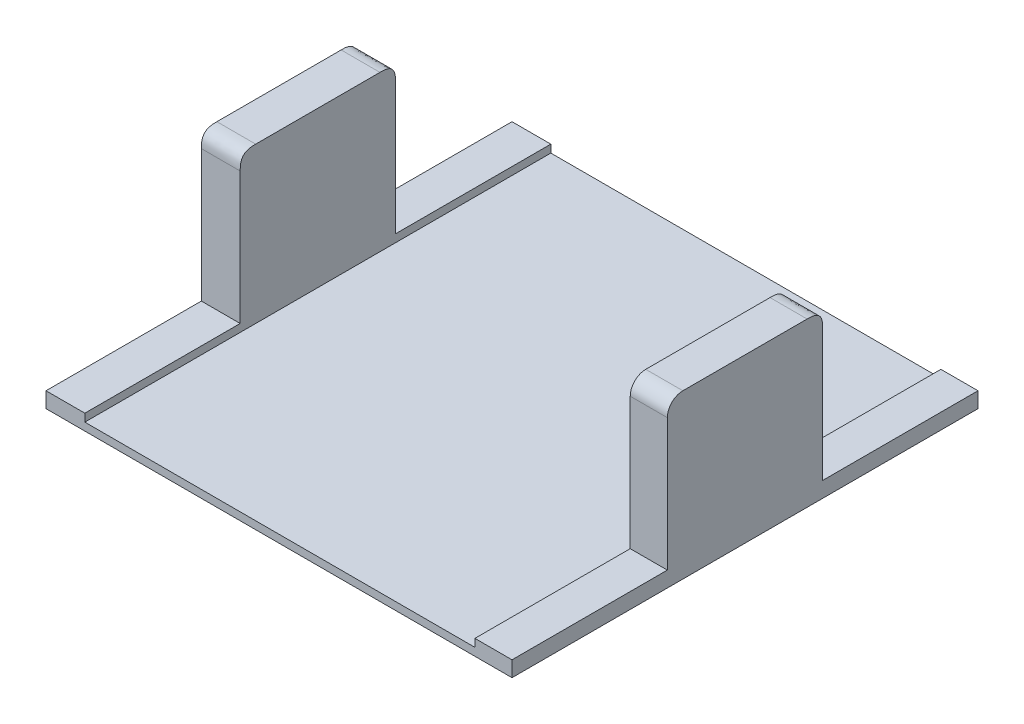
ISO-10303-21;
HEADER;
FILE_DESCRIPTION(('STEP AP214'),'2;1');
FILE_NAME('part.step','',(''),(''),'','','');
FILE_SCHEMA(('AUTOMOTIVE_DESIGN { 1 0 10303 214 1 1 1 1 }'));
ENDSEC;
DATA;
#1=APPLICATION_CONTEXT('core data for automotive mechanical design processes');
#2=APPLICATION_PROTOCOL_DEFINITION('international standard','automotive_design',2000,#1);
#3=PRODUCT_CONTEXT('',#1,'mechanical');
#4=PRODUCT('Part','Part','',(#3));
#5=PRODUCT_RELATED_PRODUCT_CATEGORY('part','',(#4));
#6=PRODUCT_DEFINITION_FORMATION('','',#4);
#7=PRODUCT_DEFINITION_CONTEXT('part definition',#1,'design');
#8=PRODUCT_DEFINITION('design','',#6,#7);
#9=PRODUCT_DEFINITION_SHAPE('','',#8);
#10=(LENGTH_UNIT() NAMED_UNIT(*) SI_UNIT(.MILLI.,.METRE.));
#11=(NAMED_UNIT(*) PLANE_ANGLE_UNIT() SI_UNIT($,.RADIAN.));
#12=(NAMED_UNIT(*) SI_UNIT($,.STERADIAN.) SOLID_ANGLE_UNIT());
#13=UNCERTAINTY_MEASURE_WITH_UNIT(LENGTH_MEASURE(1.E-05),#10,'distance_accuracy_value','');
#14=(GEOMETRIC_REPRESENTATION_CONTEXT(3) GLOBAL_UNCERTAINTY_ASSIGNED_CONTEXT((#13)) GLOBAL_UNIT_ASSIGNED_CONTEXT((#10,
#11,#12)) REPRESENTATION_CONTEXT('',''));
#15=CARTESIAN_POINT('',(0.,0.,0.));
#16=DIRECTION('',(0.,0.,1.));
#17=DIRECTION('',(1.,0.,0.));
#18=AXIS2_PLACEMENT_3D('',#15,#16,#17);
#19=CARTESIAN_POINT('',(0.,200.,0.));
#20=DIRECTION('',(0.,0.,-1.));
#21=DIRECTION('',(-1.,0.,0.));
#22=AXIS2_PLACEMENT_3D('',#19,#20,#21);
#23=PLANE('',#22);
#24=DIRECTION('',(0.,-1.,0.));
#25=VECTOR('',#24,1.);
#26=CARTESIAN_POINT('',(600.,0.,0.));
#27=LINE('',#26,#25);
#28=CARTESIAN_POINT('',(600.,10.,0.));
#29=VERTEX_POINT('',#28);
#30=CARTESIAN_POINT('',(600.,-9.99999999999998,0.));
#31=VERTEX_POINT('',#30);
#32=EDGE_CURVE('E478',#29,#31,#27,.T.);
#33=ORIENTED_EDGE('',*,*,#32,.F.);
#34=DIRECTION('',(1.,0.,0.));
#35=VECTOR('',#34,1.);
#36=CARTESIAN_POINT('',(-1.11022302462516E-13,10.,0.));
#37=LINE('',#36,#35);
#38=CARTESIAN_POINT('',(552.227783009212,10.,0.));
#39=VERTEX_POINT('',#38);
#40=EDGE_CURVE('E301',#39,#29,#37,.T.);
#41=ORIENTED_EDGE('',*,*,#40,.F.);
#42=DIRECTION('',(0.,-1.,0.));
#43=VECTOR('',#42,1.);
#44=CARTESIAN_POINT('',(552.227783009212,200.,0.));
#45=LINE('',#44,#43);
#46=CARTESIAN_POINT('',(552.227783009212,0.,0.));
#47=VERTEX_POINT('',#46);
#48=EDGE_CURVE('E492',#39,#47,#45,.T.);
#49=ORIENTED_EDGE('',*,*,#48,.T.);
#50=DIRECTION('',(1.,0.,0.));
#51=VECTOR('',#50,1.);
#52=CARTESIAN_POINT('',(600.,0.,0.));
#53=LINE('',#52,#51);
#54=CARTESIAN_POINT('',(50.,0.,0.));
#55=VERTEX_POINT('',#54);
#56=EDGE_CURVE('E479',#55,#47,#53,.T.);
#57=ORIENTED_EDGE('',*,*,#56,.F.);
#58=DIRECTION('',(0.,-1.,0.));
#59=VECTOR('',#58,1.);
#60=CARTESIAN_POINT('',(50.,200.,0.));
#61=LINE('',#60,#59);
#62=CARTESIAN_POINT('',(50.,10.,0.));
#63=VERTEX_POINT('',#62);
#64=EDGE_CURVE('E435',#63,#55,#61,.T.);
#65=ORIENTED_EDGE('',*,*,#64,.F.);
#66=CARTESIAN_POINT('',(-1.11022302462516E-13,10.,0.));
#67=VERTEX_POINT('',#66);
#68=EDGE_CURVE('E320',#67,#63,#37,.T.);
#69=ORIENTED_EDGE('',*,*,#68,.F.);
#70=DIRECTION('',(0.,-1.,0.));
#71=VECTOR('',#70,1.);
#72=CARTESIAN_POINT('',(0.,200.,0.));
#73=LINE('',#72,#71);
#74=CARTESIAN_POINT('',(-1.11022302462516E-13,-9.99999999999998,0.));
#75=VERTEX_POINT('',#74);
#76=EDGE_CURVE('E441',#67,#75,#73,.T.);
#77=ORIENTED_EDGE('',*,*,#76,.T.);
#78=DIRECTION('',(1.,0.,0.));
#79=VECTOR('',#78,1.);
#80=CARTESIAN_POINT('',(600.,-9.99999999999998,0.));
#81=LINE('',#80,#79);
#82=EDGE_CURVE('E482',#75,#31,#81,.T.);
#83=ORIENTED_EDGE('',*,*,#82,.T.);
#84=EDGE_LOOP('',(#33,#41,#49,#57,#65,#69,#77,#83));
#85=FACE_BOUND('',#84,.T.);
#86=ADVANCED_FACE('F42',(#85),#23,.F.);
#87=CARTESIAN_POINT('',(50.,200.,0.));
#88=DIRECTION('',(-1.,0.,0.));
#89=DIRECTION('',(0.,0.,1.));
#90=AXIS2_PLACEMENT_3D('',#87,#88,#89);
#91=PLANE('',#90);
#92=DIRECTION('',(0.,1.,0.));
#93=VECTOR('',#92,1.);
#94=CARTESIAN_POINT('',(50.,200.,-400.));
#95=LINE('',#94,#93);
#96=CARTESIAN_POINT('',(50.,9.9999999999999,-400.));
#97=VERTEX_POINT('',#96);
#98=CARTESIAN_POINT('',(50.,180.,-400.));
#99=VERTEX_POINT('',#98);
#100=EDGE_CURVE('E203',#97,#99,#95,.T.);
#101=ORIENTED_EDGE('',*,*,#100,.T.);
#102=CARTESIAN_POINT('',(49.999999999997,200.,-380.));
#103=CARTESIAN_POINT('',(49.999999999997,200.,-383.363961030679));
#104=CARTESIAN_POINT('',(49.999999999997,200.,-386.727922061358));
#105=CARTESIAN_POINT('',(50.0000000000049,198.566161603278,-394.142135623731));
#106=CARTESIAN_POINT('',(50.0000000000049,194.142135623731,-398.566161603278));
#107=CARTESIAN_POINT('',(49.999999999997,186.727922061358,-400.));
#108=CARTESIAN_POINT('',(49.999999999997,183.363961030679,-400.));
#109=CARTESIAN_POINT('',(49.999999999997,180.,-400.));
#110=B_SPLINE_CURVE_WITH_KNOTS('',5,(#102,#103,#104,#105,#106,#107,#108,#109),.UNSPECIFIED.,.F.,
.F.,(6,2,6),(0.,0.5,1.),.UNSPECIFIED.);
#111=CARTESIAN_POINT('',(50.,200.,-380.));
#112=VERTEX_POINT('',#111);
#113=EDGE_CURVE('E71',#99,#112,#110,.F.);
#114=ORIENTED_EDGE('',*,*,#113,.T.);
#115=DIRECTION('',(0.,0.,-1.));
#116=VECTOR('',#115,1.);
#117=CARTESIAN_POINT('',(50.,200.,0.));
#118=LINE('',#117,#116);
#119=CARTESIAN_POINT('',(50.,200.,-220.));
#120=VERTEX_POINT('',#119);
#121=EDGE_CURVE('E447',#120,#112,#118,.T.);
#122=ORIENTED_EDGE('',*,*,#121,.F.);
#123=CARTESIAN_POINT('',(49.999999999997,180.,-200.));
#124=CARTESIAN_POINT('',(49.999999999997,183.363961030679,-200.));
#125=CARTESIAN_POINT('',(49.999999999997,186.727922061358,-200.));
#126=CARTESIAN_POINT('',(50.0000000000049,194.142135623731,-201.433838396722));
#127=CARTESIAN_POINT('',(50.0000000000049,198.566161603278,-205.857864376269));
#128=CARTESIAN_POINT('',(49.999999999997,200.,-213.272077938642));
#129=CARTESIAN_POINT('',(49.999999999997,200.,-216.636038969321));
#130=CARTESIAN_POINT('',(49.999999999997,200.,-220.));
#131=B_SPLINE_CURVE_WITH_KNOTS('',5,(#123,#124,#125,#126,#127,#128,#129,#130),.UNSPECIFIED.,.F.,
.F.,(6,2,6),(0.,0.5,1.),.UNSPECIFIED.);
#132=CARTESIAN_POINT('',(50.,180.,-200.));
#133=VERTEX_POINT('',#132);
#134=EDGE_CURVE('E398',#120,#133,#131,.F.);
#135=ORIENTED_EDGE('',*,*,#134,.T.);
#136=DIRECTION('',(0.,-1.,0.));
#137=VECTOR('',#136,1.);
#138=CARTESIAN_POINT('',(50.,200.,-200.));
#139=LINE('',#138,#137);
#140=CARTESIAN_POINT('',(50.,10.,-200.));
#141=VERTEX_POINT('',#140);
#142=EDGE_CURVE('E323',#133,#141,#139,.T.);
#143=ORIENTED_EDGE('',*,*,#142,.T.);
#144=DIRECTION('',(0.,0.,1.));
#145=VECTOR('',#144,1.);
#146=CARTESIAN_POINT('',(50.,10.,0.));
#147=LINE('',#146,#145);
#148=EDGE_CURVE('E326',#141,#63,#147,.T.);
#149=ORIENTED_EDGE('',*,*,#148,.T.);
#150=ORIENTED_EDGE('',*,*,#64,.T.);
#151=DIRECTION('',(0.,0.,-1.));
#152=VECTOR('',#151,1.);
#153=CARTESIAN_POINT('',(50.,0.,0.));
#154=LINE('',#153,#152);
#155=CARTESIAN_POINT('',(50.,0.,-600.));
#156=VERTEX_POINT('',#155);
#157=EDGE_CURVE('E444',#55,#156,#154,.T.);
#158=ORIENTED_EDGE('',*,*,#157,.T.);
#159=DIRECTION('',(0.,-1.,0.));
#160=VECTOR('',#159,1.);
#161=CARTESIAN_POINT('',(50.,200.,-600.));
#162=LINE('',#161,#160);
#163=CARTESIAN_POINT('',(50.,10.,-600.));
#164=VERTEX_POINT('',#163);
#165=EDGE_CURVE('E437',#164,#156,#162,.T.);
#166=ORIENTED_EDGE('',*,*,#165,.F.);
#167=DIRECTION('',(0.,0.,1.));
#168=VECTOR('',#167,1.);
#169=CARTESIAN_POINT('',(50.,9.9999999999997,-1.00527225432856E-13));
#170=LINE('',#169,#168);
#171=EDGE_CURVE('E312',#164,#97,#170,.T.);
#172=ORIENTED_EDGE('',*,*,#171,.T.);
#173=EDGE_LOOP('',(#101,#114,#122,#135,#143,#149,#150,#158,#166,#172));
#174=FACE_BOUND('',#173,.T.);
#175=ADVANCED_FACE('F272',(#174),#91,.F.);
#176=CARTESIAN_POINT('',(0.,200.,-600.));
#177=DIRECTION('',(0.,0.,-1.));
#178=DIRECTION('',(-1.,0.,0.));
#179=AXIS2_PLACEMENT_3D('',#176,#177,#178);
#180=PLANE('',#179);
#181=DIRECTION('',(1.,0.,0.));
#182=VECTOR('',#181,1.);
#183=CARTESIAN_POINT('',(0.,10.,-600.));
#184=LINE('',#183,#182);
#185=CARTESIAN_POINT('',(552.227783009212,10.,-600.));
#186=VERTEX_POINT('',#185);
#187=CARTESIAN_POINT('',(600.,10.,-600.));
#188=VERTEX_POINT('',#187);
#189=EDGE_CURVE('E206',#186,#188,#184,.T.);
#190=ORIENTED_EDGE('',*,*,#189,.T.);
#191=DIRECTION('',(0.,-1.,0.));
#192=VECTOR('',#191,1.);
#193=CARTESIAN_POINT('',(600.,0.,-600.));
#194=LINE('',#193,#192);
#195=CARTESIAN_POINT('',(600.,-9.99999999999998,-600.));
#196=VERTEX_POINT('',#195);
#197=EDGE_CURVE('E448',#188,#196,#194,.T.);
#198=ORIENTED_EDGE('',*,*,#197,.T.);
#199=DIRECTION('',(-1.,0.,0.));
#200=VECTOR('',#199,1.);
#201=CARTESIAN_POINT('',(600.,-9.99999999999998,-600.));
#202=LINE('',#201,#200);
#203=CARTESIAN_POINT('',(-1.11022302462516E-13,-9.99999999999998,-600.));
#204=VERTEX_POINT('',#203);
#205=EDGE_CURVE('E489',#196,#204,#202,.T.);
#206=ORIENTED_EDGE('',*,*,#205,.T.);
#207=DIRECTION('',(0.,-1.,0.));
#208=VECTOR('',#207,1.);
#209=CARTESIAN_POINT('',(-1.11022302462516E-13,200.,-600.));
#210=LINE('',#209,#208);
#211=CARTESIAN_POINT('',(0.,10.,-600.));
#212=VERTEX_POINT('',#211);
#213=EDGE_CURVE('E439',#212,#204,#210,.T.);
#214=ORIENTED_EDGE('',*,*,#213,.F.);
#215=EDGE_CURVE('E211',#212,#164,#184,.T.);
#216=ORIENTED_EDGE('',*,*,#215,.T.);
#217=ORIENTED_EDGE('',*,*,#165,.T.);
#218=DIRECTION('',(-1.,0.,0.));
#219=VECTOR('',#218,1.);
#220=CARTESIAN_POINT('',(600.,0.,-600.));
#221=LINE('',#220,#219);
#222=CARTESIAN_POINT('',(552.227783009212,0.,-600.));
#223=VERTEX_POINT('',#222);
#224=EDGE_CURVE('E485',#223,#156,#221,.T.);
#225=ORIENTED_EDGE('',*,*,#224,.F.);
#226=DIRECTION('',(0.,-1.,0.));
#227=VECTOR('',#226,1.);
#228=CARTESIAN_POINT('',(552.227783009212,200.,-600.));
#229=LINE('',#228,#227);
#230=EDGE_CURVE('E471',#186,#223,#229,.T.);
#231=ORIENTED_EDGE('',*,*,#230,.F.);
#232=EDGE_LOOP('',(#190,#198,#206,#214,#216,#217,#225,#231));
#233=FACE_BOUND('',#232,.T.);
#234=ADVANCED_FACE('F282',(#233),#180,.T.);
#235=CARTESIAN_POINT('',(0.,200.,0.));
#236=DIRECTION('',(-1.,0.,0.));
#237=DIRECTION('',(0.,0.,1.));
#238=AXIS2_PLACEMENT_3D('',#235,#236,#237);
#239=PLANE('',#238);
#240=DIRECTION('',(0.,0.,-1.));
#241=VECTOR('',#240,1.);
#242=CARTESIAN_POINT('',(0.,200.,0.));
#243=LINE('',#242,#241);
#244=CARTESIAN_POINT('',(0.,200.,-220.));
#245=VERTEX_POINT('',#244);
#246=CARTESIAN_POINT('',(0.,200.,-380.));
#247=VERTEX_POINT('',#246);
#248=EDGE_CURVE('E443',#245,#247,#243,.T.);
#249=ORIENTED_EDGE('',*,*,#248,.T.);
#250=CARTESIAN_POINT('',(-2.10443641679436E-13,180.,-400.));
#251=CARTESIAN_POINT('',(-2.10443641679436E-13,183.363961030679,-400.));
#252=CARTESIAN_POINT('',(-2.10443641679436E-13,186.727922061358,-400.));
#253=CARTESIAN_POINT('',(1.66208193042028E-13,194.142135623731,-398.566161603278));
#254=CARTESIAN_POINT('',(1.66208193042028E-13,198.566161603278,-394.142135623731));
#255=CARTESIAN_POINT('',(-2.10443641679436E-13,200.,-386.727922061358));
#256=CARTESIAN_POINT('',(-2.10443641679436E-13,200.,-383.363961030679));
#257=CARTESIAN_POINT('',(-2.10443641679436E-13,200.,-380.));
#258=B_SPLINE_CURVE_WITH_KNOTS('',5,(#250,#251,#252,#253,#254,#255,#256,#257),.UNSPECIFIED.,.F.,
.F.,(6,2,6),(0.,0.5,1.),.UNSPECIFIED.);
#259=CARTESIAN_POINT('',(0.,180.,-400.));
#260=VERTEX_POINT('',#259);
#261=EDGE_CURVE('E11',#247,#260,#258,.F.);
#262=ORIENTED_EDGE('',*,*,#261,.T.);
#263=DIRECTION('',(0.,-1.,0.));
#264=VECTOR('',#263,1.);
#265=CARTESIAN_POINT('',(0.,200.,-400.));
#266=LINE('',#265,#264);
#267=CARTESIAN_POINT('',(0.,9.9999999999999,-400.));
#268=VERTEX_POINT('',#267);
#269=EDGE_CURVE('E187',#260,#268,#266,.T.);
#270=ORIENTED_EDGE('',*,*,#269,.T.);
#271=DIRECTION('',(0.,0.,-1.));
#272=VECTOR('',#271,1.);
#273=CARTESIAN_POINT('',(0.,10.,-600.));
#274=LINE('',#273,#272);
#275=EDGE_CURVE('E191',#268,#212,#274,.T.);
#276=ORIENTED_EDGE('',*,*,#275,.T.);
#277=ORIENTED_EDGE('',*,*,#213,.T.);
#278=DIRECTION('',(0.,0.,1.));
#279=VECTOR('',#278,1.);
#280=CARTESIAN_POINT('',(-1.11022302462516E-13,-9.99999999999998,0.));
#281=LINE('',#280,#279);
#282=EDGE_CURVE('E486',#204,#75,#281,.T.);
#283=ORIENTED_EDGE('',*,*,#282,.T.);
#284=ORIENTED_EDGE('',*,*,#76,.F.);
#285=DIRECTION('',(0.,0.,-1.));
#286=VECTOR('',#285,1.);
#287=CARTESIAN_POINT('',(-1.11022302462516E-13,10.,0.));
#288=LINE('',#287,#286);
#289=CARTESIAN_POINT('',(-1.11022302462516E-13,10.,-200.));
#290=VERTEX_POINT('',#289);
#291=EDGE_CURVE('E302',#67,#290,#288,.T.);
#292=ORIENTED_EDGE('',*,*,#291,.T.);
#293=DIRECTION('',(0.,1.,0.));
#294=VECTOR('',#293,1.);
#295=CARTESIAN_POINT('',(-1.11022302462516E-13,200.,-200.));
#296=LINE('',#295,#294);
#297=CARTESIAN_POINT('',(-1.11022302462516E-13,180.,-200.));
#298=VERTEX_POINT('',#297);
#299=EDGE_CURVE('E292',#290,#298,#296,.T.);
#300=ORIENTED_EDGE('',*,*,#299,.T.);
#301=CARTESIAN_POINT('',(-1.87350135405495E-13,200.,-220.));
#302=CARTESIAN_POINT('',(-1.87350135405495E-13,200.,-216.636038969321));
#303=CARTESIAN_POINT('',(-1.87350135405495E-13,200.,-213.272077938642));
#304=CARTESIAN_POINT('',(1.88976438664223E-13,198.566161603278,-205.857864376269));
#305=CARTESIAN_POINT('',(1.88976438664223E-13,194.142135623731,-201.433838396722));
#306=CARTESIAN_POINT('',(-1.87350135405495E-13,186.727922061358,-200.));
#307=CARTESIAN_POINT('',(-1.87350135405495E-13,183.363961030679,-200.));
#308=CARTESIAN_POINT('',(-1.87350135405495E-13,180.,-200.));
#309=B_SPLINE_CURVE_WITH_KNOTS('',5,(#301,#302,#303,#304,#305,#306,#307,#308),.UNSPECIFIED.,.F.,
.F.,(6,2,6),(0.,0.5,1.),.UNSPECIFIED.);
#310=EDGE_CURVE('E394',#298,#245,#309,.F.);
#311=ORIENTED_EDGE('',*,*,#310,.T.);
#312=EDGE_LOOP('',(#249,#262,#270,#276,#277,#283,#284,#292,#300,#311));
#313=FACE_BOUND('',#312,.T.);
#314=ADVANCED_FACE('F189',(#313),#239,.T.);
#315=CARTESIAN_POINT('',(0.,200.,0.));
#316=DIRECTION('',(0.,1.,0.));
#317=DIRECTION('',(0.,0.,1.));
#318=AXIS2_PLACEMENT_3D('',#315,#316,#317);
#319=PLANE('',#318);
#320=ORIENTED_EDGE('',*,*,#121,.T.);
#321=CARTESIAN_POINT('',(-2.50000000000008,200.,-380.));
#322=CARTESIAN_POINT('',(15.8333333333333,200.,-380.));
#323=CARTESIAN_POINT('',(34.1666666666666,200.,-380.));
#324=CARTESIAN_POINT('',(52.5,200.,-380.));
#325=B_SPLINE_CURVE_WITH_KNOTS('',3,(#321,#322,#323,#324),.UNSPECIFIED.,.F.,.F.,(4,4),(-0.0525,
0.00250000000000008),.UNSPECIFIED.);
#326=EDGE_CURVE('E56',#112,#247,#325,.F.);
#327=ORIENTED_EDGE('',*,*,#326,.T.);
#328=ORIENTED_EDGE('',*,*,#248,.F.);
#329=CARTESIAN_POINT('',(52.5,200.,-220.));
#330=CARTESIAN_POINT('',(34.1666666666666,200.,-220.));
#331=CARTESIAN_POINT('',(15.8333333333333,200.,-220.));
#332=CARTESIAN_POINT('',(-2.5000000000001,200.,-220.));
#333=B_SPLINE_CURVE_WITH_KNOTS('',3,(#329,#330,#331,#332),.UNSPECIFIED.,.F.,.F.,(4,4),(-0.0525,
0.00250000000000012),.UNSPECIFIED.);
#334=EDGE_CURVE('E403',#245,#120,#333,.F.);
#335=ORIENTED_EDGE('',*,*,#334,.T.);
#336=EDGE_LOOP('',(#320,#327,#328,#335));
#337=FACE_BOUND('',#336,.T.);
#338=ADVANCED_FACE('F335',(#337),#319,.T.);
#339=CARTESIAN_POINT('',(0.,0.,0.));
#340=DIRECTION('',(0.,1.,0.));
#341=DIRECTION('',(0.,0.,1.));
#342=AXIS2_PLACEMENT_3D('',#339,#340,#341);
#343=PLANE('',#342);
#344=DIRECTION('',(0.,0.,-1.));
#345=VECTOR('',#344,1.);
#346=CARTESIAN_POINT('',(552.227783009212,0.,0.));
#347=LINE('',#346,#345);
#348=EDGE_CURVE('E499',#47,#223,#347,.T.);
#349=ORIENTED_EDGE('',*,*,#348,.T.);
#350=ORIENTED_EDGE('',*,*,#224,.T.);
#351=ORIENTED_EDGE('',*,*,#157,.F.);
#352=ORIENTED_EDGE('',*,*,#56,.T.);
#353=EDGE_LOOP('',(#349,#350,#351,#352));
#354=FACE_BOUND('',#353,.T.);
#355=ADVANCED_FACE('F344',(#354),#343,.T.);
#356=CARTESIAN_POINT('',(600.,0.,0.));
#357=DIRECTION('',(-1.,0.,0.));
#358=DIRECTION('',(0.,0.,1.));
#359=AXIS2_PLACEMENT_3D('',#356,#357,#358);
#360=PLANE('',#359);
#361=DIRECTION('',(0.,-1.,0.));
#362=VECTOR('',#361,1.);
#363=CARTESIAN_POINT('',(600.,200.,-400.));
#364=LINE('',#363,#362);
#365=CARTESIAN_POINT('',(600.,180.,-400.));
#366=VERTEX_POINT('',#365);
#367=CARTESIAN_POINT('',(600.,9.9999999999999,-400.));
#368=VERTEX_POINT('',#367);
#369=EDGE_CURVE('E221',#366,#368,#364,.T.);
#370=ORIENTED_EDGE('',*,*,#369,.F.);
#371=CARTESIAN_POINT('',(600.,200.,-380.));
#372=CARTESIAN_POINT('',(600.,200.,-383.363961030679));
#373=CARTESIAN_POINT('',(600.,200.,-386.727922061358));
#374=CARTESIAN_POINT('',(600.,198.566161603278,-394.142135623731));
#375=CARTESIAN_POINT('',(600.,194.142135623731,-398.566161603278));
#376=CARTESIAN_POINT('',(600.,186.727922061358,-400.));
#377=CARTESIAN_POINT('',(600.,183.363961030679,-400.));
#378=CARTESIAN_POINT('',(600.,180.,-400.));
#379=B_SPLINE_CURVE_WITH_KNOTS('',5,(#371,#372,#373,#374,#375,#376,#377,#378),.UNSPECIFIED.,.F.,
.F.,(6,2,6),(0.,0.5,1.),.UNSPECIFIED.);
#380=CARTESIAN_POINT('',(600.,200.,-380.));
#381=VERTEX_POINT('',#380);
#382=EDGE_CURVE('E412',#366,#381,#379,.F.);
#383=ORIENTED_EDGE('',*,*,#382,.T.);
#384=DIRECTION('',(0.,0.,-1.));
#385=VECTOR('',#384,1.);
#386=CARTESIAN_POINT('',(600.,200.,-1.11022302462516E-13));
#387=LINE('',#386,#385);
#388=CARTESIAN_POINT('',(600.,200.,-220.));
#389=VERTEX_POINT('',#388);
#390=EDGE_CURVE('E238',#389,#381,#387,.T.);
#391=ORIENTED_EDGE('',*,*,#390,.F.);
#392=CARTESIAN_POINT('',(600.,180.,-220.));
#393=DIRECTION('',(-1.,0.,0.));
#394=DIRECTION('',(0.,0.,1.));
#395=AXIS2_PLACEMENT_3D('',#392,#393,#394);
#396=CIRCLE('',#395,20.);
#397=CARTESIAN_POINT('',(600.,180.,-200.));
#398=VERTEX_POINT('',#397);
#399=EDGE_CURVE('E420',#389,#398,#396,.F.);
#400=ORIENTED_EDGE('',*,*,#399,.T.);
#401=DIRECTION('',(0.,1.,0.));
#402=VECTOR('',#401,1.);
#403=CARTESIAN_POINT('',(600.,200.,-200.));
#404=LINE('',#403,#402);
#405=CARTESIAN_POINT('',(600.,10.,-200.));
#406=VERTEX_POINT('',#405);
#407=EDGE_CURVE('E311',#406,#398,#404,.T.);
#408=ORIENTED_EDGE('',*,*,#407,.F.);
#409=DIRECTION('',(0.,0.,-1.));
#410=VECTOR('',#409,1.);
#411=CARTESIAN_POINT('',(600.,10.,0.));
#412=LINE('',#411,#410);
#413=EDGE_CURVE('E308',#29,#406,#412,.T.);
#414=ORIENTED_EDGE('',*,*,#413,.F.);
#415=ORIENTED_EDGE('',*,*,#32,.T.);
#416=DIRECTION('',(0.,0.,-1.));
#417=VECTOR('',#416,1.);
#418=CARTESIAN_POINT('',(600.,-9.99999999999998,0.));
#419=LINE('',#418,#417);
#420=EDGE_CURVE('E477',#31,#196,#419,.T.);
#421=ORIENTED_EDGE('',*,*,#420,.T.);
#422=ORIENTED_EDGE('',*,*,#197,.F.);
#423=DIRECTION('',(0.,0.,-1.));
#424=VECTOR('',#423,1.);
#425=CARTESIAN_POINT('',(600.,10.,-600.));
#426=LINE('',#425,#424);
#427=EDGE_CURVE('E198',#368,#188,#426,.T.);
#428=ORIENTED_EDGE('',*,*,#427,.F.);
#429=EDGE_LOOP('',(#370,#383,#391,#400,#408,#414,#415,#421,#422,#428));
#430=FACE_BOUND('',#429,.T.);
#431=ADVANCED_FACE('F345',(#430),#360,.F.);
#432=CARTESIAN_POINT('',(0.,-9.99999999999998,0.));
#433=DIRECTION('',(0.,1.,0.));
#434=DIRECTION('',(0.,0.,1.));
#435=AXIS2_PLACEMENT_3D('',#432,#433,#434);
#436=PLANE('',#435);
#437=ORIENTED_EDGE('',*,*,#420,.F.);
#438=ORIENTED_EDGE('',*,*,#82,.F.);
#439=ORIENTED_EDGE('',*,*,#282,.F.);
#440=ORIENTED_EDGE('',*,*,#205,.F.);
#441=EDGE_LOOP('',(#437,#438,#439,#440));
#442=FACE_BOUND('',#441,.T.);
#443=ADVANCED_FACE('F527',(#442),#436,.F.);
#444=CARTESIAN_POINT('',(552.227783009212,200.,0.));
#445=DIRECTION('',(-1.,0.,0.));
#446=DIRECTION('',(0.,0.,1.));
#447=AXIS2_PLACEMENT_3D('',#444,#445,#446);
#448=PLANE('',#447);
#449=DIRECTION('',(0.,0.,-1.));
#450=VECTOR('',#449,1.);
#451=CARTESIAN_POINT('',(552.227783009212,200.,0.));
#452=LINE('',#451,#450);
#453=CARTESIAN_POINT('',(552.227783009212,200.,-220.));
#454=VERTEX_POINT('',#453);
#455=CARTESIAN_POINT('',(552.227783009212,200.,-380.));
#456=VERTEX_POINT('',#455);
#457=EDGE_CURVE('E501',#454,#456,#452,.T.);
#458=ORIENTED_EDGE('',*,*,#457,.T.);
#459=CARTESIAN_POINT('',(552.227783009212,180.,-400.));
#460=CARTESIAN_POINT('',(552.227783009212,183.363961030679,-400.));
#461=CARTESIAN_POINT('',(552.227783009212,186.727922061358,-400.));
#462=CARTESIAN_POINT('',(552.227783009212,194.142135623731,-398.566161603278));
#463=CARTESIAN_POINT('',(552.227783009212,198.566161603278,-394.142135623731));
#464=CARTESIAN_POINT('',(552.227783009212,200.,-386.727922061358));
#465=CARTESIAN_POINT('',(552.227783009212,200.,-383.363961030679));
#466=CARTESIAN_POINT('',(552.227783009212,200.,-380.));
#467=B_SPLINE_CURVE_WITH_KNOTS('',5,(#459,#460,#461,#462,#463,#464,#465,#466),.UNSPECIFIED.,.F.,
.F.,(6,2,6),(0.,0.5,1.),.UNSPECIFIED.);
#468=CARTESIAN_POINT('',(552.227783009212,180.,-400.));
#469=VERTEX_POINT('',#468);
#470=EDGE_CURVE('E404',#456,#469,#467,.F.);
#471=ORIENTED_EDGE('',*,*,#470,.T.);
#472=DIRECTION('',(0.,1.,0.));
#473=VECTOR('',#472,1.);
#474=CARTESIAN_POINT('',(552.227783009212,200.,-400.));
#475=LINE('',#474,#473);
#476=CARTESIAN_POINT('',(552.227783009212,9.9999999999999,-400.));
#477=VERTEX_POINT('',#476);
#478=EDGE_CURVE('E224',#477,#469,#475,.T.);
#479=ORIENTED_EDGE('',*,*,#478,.F.);
#480=DIRECTION('',(0.,0.,1.));
#481=VECTOR('',#480,1.);
#482=CARTESIAN_POINT('',(552.227783009212,9.9999999999997,-1.00527225432856E-13));
#483=LINE('',#482,#481);
#484=EDGE_CURVE('E431',#186,#477,#483,.T.);
#485=ORIENTED_EDGE('',*,*,#484,.F.);
#486=ORIENTED_EDGE('',*,*,#230,.T.);
#487=ORIENTED_EDGE('',*,*,#348,.F.);
#488=ORIENTED_EDGE('',*,*,#48,.F.);
#489=DIRECTION('',(0.,0.,1.));
#490=VECTOR('',#489,1.);
#491=CARTESIAN_POINT('',(552.227783009212,10.,0.));
#492=LINE('',#491,#490);
#493=CARTESIAN_POINT('',(552.227783009212,10.,-200.));
#494=VERTEX_POINT('',#493);
#495=EDGE_CURVE('E433',#494,#39,#492,.T.);
#496=ORIENTED_EDGE('',*,*,#495,.F.);
#497=DIRECTION('',(0.,-1.,0.));
#498=VECTOR('',#497,1.);
#499=CARTESIAN_POINT('',(552.227783009212,200.,-200.));
#500=LINE('',#499,#498);
#501=CARTESIAN_POINT('',(552.227783009212,180.,-200.));
#502=VERTEX_POINT('',#501);
#503=EDGE_CURVE('E318',#502,#494,#500,.T.);
#504=ORIENTED_EDGE('',*,*,#503,.F.);
#505=CARTESIAN_POINT('',(552.227783009212,180.,-220.));
#506=DIRECTION('',(-1.,0.,0.));
#507=DIRECTION('',(0.,0.,1.));
#508=AXIS2_PLACEMENT_3D('',#505,#506,#507);
#509=CIRCLE('',#508,20.);
#510=EDGE_CURVE('E424',#502,#454,#509,.T.);
#511=ORIENTED_EDGE('',*,*,#510,.T.);
#512=EDGE_LOOP('',(#458,#471,#479,#485,#486,#487,#488,#496,#504,#511));
#513=FACE_BOUND('',#512,.T.);
#514=ADVANCED_FACE('F522',(#513),#448,.T.);
#515=CARTESIAN_POINT('',(0.,200.,0.));
#516=DIRECTION('',(0.,1.,0.));
#517=DIRECTION('',(0.,0.,1.));
#518=AXIS2_PLACEMENT_3D('',#515,#516,#517);
#519=PLANE('',#518);
#520=ORIENTED_EDGE('',*,*,#390,.T.);
#521=CARTESIAN_POINT('',(549.839172159672,200.,-380.));
#522=CARTESIAN_POINT('',(567.355651722961,200.,-380.));
#523=CARTESIAN_POINT('',(584.87213128625,200.,-380.));
#524=CARTESIAN_POINT('',(602.388610849539,200.,-380.));
#525=B_SPLINE_CURVE_WITH_KNOTS('',3,(#521,#522,#523,#524),.UNSPECIFIED.,.F.,.F.,(4,4),
(-0.60238861084954,-0.549839172159672),.UNSPECIFIED.);
#526=EDGE_CURVE('E406',#381,#456,#525,.F.);
#527=ORIENTED_EDGE('',*,*,#526,.T.);
#528=ORIENTED_EDGE('',*,*,#457,.F.);
#529=DIRECTION('',(-1.,0.,0.));
#530=VECTOR('',#529,1.);
#531=CARTESIAN_POINT('',(600.,200.,-220.));
#532=LINE('',#531,#530);
#533=EDGE_CURVE('E421',#454,#389,#532,.F.);
#534=ORIENTED_EDGE('',*,*,#533,.T.);
#535=EDGE_LOOP('',(#520,#527,#528,#534));
#536=FACE_BOUND('',#535,.T.);
#537=ADVANCED_FACE('F513',(#536),#519,.T.);
#538=CARTESIAN_POINT('',(-1.11022302462516E-13,200.,-200.));
#539=DIRECTION('',(0.,0.,-1.));
#540=DIRECTION('',(-1.,0.,0.));
#541=AXIS2_PLACEMENT_3D('',#538,#539,#540);
#542=PLANE('',#541);
#543=ORIENTED_EDGE('',*,*,#407,.T.);
#544=DIRECTION('',(-1.,0.,0.));
#545=VECTOR('',#544,1.);
#546=CARTESIAN_POINT('',(552.227783009212,180.,-200.));
#547=LINE('',#546,#545);
#548=EDGE_CURVE('E428',#398,#502,#547,.T.);
#549=ORIENTED_EDGE('',*,*,#548,.T.);
#550=ORIENTED_EDGE('',*,*,#503,.T.);
#551=DIRECTION('',(1.,0.,0.));
#552=VECTOR('',#551,1.);
#553=CARTESIAN_POINT('',(-1.11022302462516E-13,10.,-200.));
#554=LINE('',#553,#552);
#555=EDGE_CURVE('E319',#494,#406,#554,.T.);
#556=ORIENTED_EDGE('',*,*,#555,.T.);
#557=EDGE_LOOP('',(#543,#549,#550,#556));
#558=FACE_BOUND('',#557,.T.);
#559=ADVANCED_FACE('F253',(#558),#542,.F.);
#560=CARTESIAN_POINT('',(-1.11022302462516E-13,10.,0.));
#561=DIRECTION('',(0.,-1.,0.));
#562=DIRECTION('',(0.,0.,-1.));
#563=AXIS2_PLACEMENT_3D('',#560,#561,#562);
#564=PLANE('',#563);
#565=ORIENTED_EDGE('',*,*,#495,.T.);
#566=ORIENTED_EDGE('',*,*,#40,.T.);
#567=ORIENTED_EDGE('',*,*,#413,.T.);
#568=ORIENTED_EDGE('',*,*,#555,.F.);
#569=EDGE_LOOP('',(#565,#566,#567,#568));
#570=FACE_BOUND('',#569,.T.);
#571=ADVANCED_FACE('F523',(#570),#564,.F.);
#572=EDGE_CURVE('E315',#290,#141,#554,.T.);
#573=ORIENTED_EDGE('',*,*,#572,.F.);
#574=ORIENTED_EDGE('',*,*,#291,.F.);
#575=ORIENTED_EDGE('',*,*,#68,.T.);
#576=ORIENTED_EDGE('',*,*,#148,.F.);
#577=EDGE_LOOP('',(#573,#574,#575,#576));
#578=FACE_BOUND('',#577,.T.);
#579=ADVANCED_FACE('F726',(#578),#564,.F.);
#580=ORIENTED_EDGE('',*,*,#142,.F.);
#581=CARTESIAN_POINT('',(-2.5000000000001,180.,-200.));
#582=CARTESIAN_POINT('',(15.8333333333333,180.,-200.));
#583=CARTESIAN_POINT('',(34.1666666666666,180.,-200.));
#584=CARTESIAN_POINT('',(52.5,180.,-200.));
#585=B_SPLINE_CURVE_WITH_KNOTS('',3,(#581,#582,#583,#584),.UNSPECIFIED.,.F.,.F.,(4,4),(-0.0525,
0.00250000000000011),.UNSPECIFIED.);
#586=EDGE_CURVE('E395',#133,#298,#585,.F.);
#587=ORIENTED_EDGE('',*,*,#586,.T.);
#588=ORIENTED_EDGE('',*,*,#299,.F.);
#589=ORIENTED_EDGE('',*,*,#572,.T.);
#590=EDGE_LOOP('',(#580,#587,#588,#589));
#591=FACE_BOUND('',#590,.T.);
#592=ADVANCED_FACE('F252',(#591),#542,.F.);
#593=CARTESIAN_POINT('',(0.,200.,-400.));
#594=DIRECTION('',(0.,0.,1.));
#595=DIRECTION('',(0.,-1.,0.));
#596=AXIS2_PLACEMENT_3D('',#593,#594,#595);
#597=PLANE('',#596);
#598=ORIENTED_EDGE('',*,*,#478,.T.);
#599=CARTESIAN_POINT('',(602.388610849539,180.,-400.));
#600=CARTESIAN_POINT('',(584.87213128625,180.,-400.));
#601=CARTESIAN_POINT('',(567.355651722961,180.,-400.));
#602=CARTESIAN_POINT('',(549.839172159672,180.,-400.));
#603=B_SPLINE_CURVE_WITH_KNOTS('',3,(#599,#600,#601,#602),.UNSPECIFIED.,.F.,.F.,(4,4),
(-0.602388610849539,-0.549839172159672),.UNSPECIFIED.);
#604=EDGE_CURVE('E232',#469,#366,#603,.F.);
#605=ORIENTED_EDGE('',*,*,#604,.T.);
#606=ORIENTED_EDGE('',*,*,#369,.T.);
#607=DIRECTION('',(1.,0.,0.));
#608=VECTOR('',#607,1.);
#609=CARTESIAN_POINT('',(0.,9.9999999999999,-400.));
#610=LINE('',#609,#608);
#611=EDGE_CURVE('E207',#477,#368,#610,.T.);
#612=ORIENTED_EDGE('',*,*,#611,.F.);
#613=EDGE_LOOP('',(#598,#605,#606,#612));
#614=FACE_BOUND('',#613,.T.);
#615=ADVANCED_FACE('F241',(#614),#597,.F.);
#616=CARTESIAN_POINT('',(0.,10.,-600.));
#617=DIRECTION('',(0.,-1.,0.));
#618=DIRECTION('',(0.,0.,-1.));
#619=AXIS2_PLACEMENT_3D('',#616,#617,#618);
#620=PLANE('',#619);
#621=ORIENTED_EDGE('',*,*,#484,.T.);
#622=ORIENTED_EDGE('',*,*,#611,.T.);
#623=ORIENTED_EDGE('',*,*,#427,.T.);
#624=ORIENTED_EDGE('',*,*,#189,.F.);
#625=EDGE_LOOP('',(#621,#622,#623,#624));
#626=FACE_BOUND('',#625,.T.);
#627=ADVANCED_FACE('F251',(#626),#620,.F.);
#628=ORIENTED_EDGE('',*,*,#215,.F.);
#629=ORIENTED_EDGE('',*,*,#275,.F.);
#630=EDGE_CURVE('E201',#268,#97,#610,.T.);
#631=ORIENTED_EDGE('',*,*,#630,.T.);
#632=ORIENTED_EDGE('',*,*,#171,.F.);
#633=EDGE_LOOP('',(#628,#629,#631,#632));
#634=FACE_BOUND('',#633,.T.);
#635=ADVANCED_FACE('F209',(#634),#620,.F.);
#636=ORIENTED_EDGE('',*,*,#269,.F.);
#637=CARTESIAN_POINT('',(52.5,180.,-400.));
#638=CARTESIAN_POINT('',(34.1666666666666,180.,-400.));
#639=CARTESIAN_POINT('',(15.8333333333333,180.,-400.));
#640=CARTESIAN_POINT('',(-2.50000000000008,180.,-400.));
#641=B_SPLINE_CURVE_WITH_KNOTS('',3,(#637,#638,#639,#640),.UNSPECIFIED.,.F.,.F.,(4,4),(-0.0525,
0.00250000000000008),.UNSPECIFIED.);
#642=EDGE_CURVE('E377',#260,#99,#641,.F.);
#643=ORIENTED_EDGE('',*,*,#642,.T.);
#644=ORIENTED_EDGE('',*,*,#100,.F.);
#645=ORIENTED_EDGE('',*,*,#630,.F.);
#646=EDGE_LOOP('',(#636,#643,#644,#645));
#647=FACE_BOUND('',#646,.T.);
#648=ADVANCED_FACE('F202',(#647),#597,.F.);
#649=CARTESIAN_POINT('',(-1.11022302462516E-13,180.,-220.));
#650=DIRECTION('',(1.,0.,0.));
#651=DIRECTION('',(0.,0.,-1.));
#652=AXIS2_PLACEMENT_3D('',#649,#650,#651);
#653=CYLINDRICAL_SURFACE('',#652,20.);
#654=ORIENTED_EDGE('',*,*,#399,.F.);
#655=ORIENTED_EDGE('',*,*,#533,.F.);
#656=ORIENTED_EDGE('',*,*,#510,.F.);
#657=ORIENTED_EDGE('',*,*,#548,.F.);
#658=EDGE_LOOP('',(#654,#655,#656,#657));
#659=FACE_BOUND('',#658,.T.);
#660=ADVANCED_FACE('F557',(#659),#653,.T.);
#661=CARTESIAN_POINT('',(602.388610849539,200.,-380.));
#662=CARTESIAN_POINT('',(584.87213128625,200.,-380.));
#663=CARTESIAN_POINT('',(567.355651722961,200.,-380.));
#664=CARTESIAN_POINT('',(549.839172159672,200.,-380.));
#665=CARTESIAN_POINT('',(602.388610849539,200.,-383.363961030679));
#666=CARTESIAN_POINT('',(584.87213128625,200.,-383.363961030679));
#667=CARTESIAN_POINT('',(567.355651722961,200.,-383.363961030679));
#668=CARTESIAN_POINT('',(549.839172159672,200.,-383.363961030679));
#669=CARTESIAN_POINT('',(602.388610849539,200.,-386.727922061358));
#670=CARTESIAN_POINT('',(584.87213128625,200.,-386.727922061358));
#671=CARTESIAN_POINT('',(567.355651722961,200.,-386.727922061358));
#672=CARTESIAN_POINT('',(549.839172159672,200.,-386.727922061358));
#673=CARTESIAN_POINT('',(602.388610849539,198.566161603278,-394.142135623731));
#674=CARTESIAN_POINT('',(584.87213128625,198.566161603278,-394.142135623731));
#675=CARTESIAN_POINT('',(567.355651722961,198.566161603278,-394.142135623731));
#676=CARTESIAN_POINT('',(549.839172159672,198.566161603278,-394.142135623731));
#677=CARTESIAN_POINT('',(602.388610849539,194.142135623731,-398.566161603278));
#678=CARTESIAN_POINT('',(584.87213128625,194.142135623731,-398.566161603278));
#679=CARTESIAN_POINT('',(567.355651722961,194.142135623731,-398.566161603278));
#680=CARTESIAN_POINT('',(549.839172159672,194.142135623731,-398.566161603278));
#681=CARTESIAN_POINT('',(602.388610849539,186.727922061358,-400.));
#682=CARTESIAN_POINT('',(584.87213128625,186.727922061358,-400.));
#683=CARTESIAN_POINT('',(567.355651722961,186.727922061358,-400.));
#684=CARTESIAN_POINT('',(549.839172159672,186.727922061358,-400.));
#685=CARTESIAN_POINT('',(602.388610849539,183.363961030679,-400.));
#686=CARTESIAN_POINT('',(584.87213128625,183.363961030679,-400.));
#687=CARTESIAN_POINT('',(567.355651722961,183.363961030679,-400.));
#688=CARTESIAN_POINT('',(549.839172159672,183.363961030679,-400.));
#689=CARTESIAN_POINT('',(602.388610849539,180.,-400.));
#690=CARTESIAN_POINT('',(584.87213128625,180.,-400.));
#691=CARTESIAN_POINT('',(567.355651722961,180.,-400.));
#692=CARTESIAN_POINT('',(549.839172159672,180.,-400.));
#693=B_SPLINE_SURFACE_WITH_KNOTS('',5,3,((#661,#662,#663,#664),(#665,#666,#667,#668),(#669,#670,
#671,#672),(#673,#674,#675,#676),(#677,#678,#679,#680),(#681,#682,#683,#684),(#685,#686,#687,
#688),(#689,#690,#691,#692)),.UNSPECIFIED.,.F.,.F.,.F.,(6,2,6),(4,4),(0.,0.5,1.),
(-0.602388610849539,-0.549839172159672),.UNSPECIFIED.);
#694=ORIENTED_EDGE('',*,*,#470,.F.);
#695=ORIENTED_EDGE('',*,*,#526,.F.);
#696=ORIENTED_EDGE('',*,*,#382,.F.);
#697=ORIENTED_EDGE('',*,*,#604,.F.);
#698=EDGE_LOOP('',(#694,#695,#696,#697));
#699=FACE_BOUND('',#698,.T.);
#700=ADVANCED_FACE('F543',(#699),#693,.T.);
#701=CARTESIAN_POINT('',(52.5,180.,-200.));
#702=CARTESIAN_POINT('',(34.1666666666666,180.,-200.));
#703=CARTESIAN_POINT('',(15.8333333333333,180.,-200.));
#704=CARTESIAN_POINT('',(-2.5000000000001,180.,-200.));
#705=CARTESIAN_POINT('',(52.5,183.363961030679,-200.));
#706=CARTESIAN_POINT('',(34.1666666666666,183.363961030679,-200.));
#707=CARTESIAN_POINT('',(15.8333333333333,183.363961030679,-200.));
#708=CARTESIAN_POINT('',(-2.5000000000001,183.363961030679,-200.));
#709=CARTESIAN_POINT('',(52.5,186.727922061358,-200.));
#710=CARTESIAN_POINT('',(34.1666666666666,186.727922061358,-200.));
#711=CARTESIAN_POINT('',(15.8333333333333,186.727922061358,-200.));
#712=CARTESIAN_POINT('',(-2.5000000000001,186.727922061358,-200.));
#713=CARTESIAN_POINT('',(52.5,194.142135623731,-201.433838396722));
#714=CARTESIAN_POINT('',(34.1666666667302,194.142135623731,-201.433838396722));
#715=CARTESIAN_POINT('',(15.8333333333333,194.142135623731,-201.433838396722));
#716=CARTESIAN_POINT('',(-2.5000000000001,194.142135623731,-201.433838396722));
#717=CARTESIAN_POINT('',(52.5,198.566161603278,-205.857864376269));
#718=CARTESIAN_POINT('',(34.1666666667302,198.566161603278,-205.857864376269));
#719=CARTESIAN_POINT('',(15.8333333333333,198.566161603278,-205.857864376269));
#720=CARTESIAN_POINT('',(-2.5000000000001,198.566161603278,-205.857864376269));
#721=CARTESIAN_POINT('',(52.5,200.,-213.272077938642));
#722=CARTESIAN_POINT('',(34.1666666666666,200.,-213.272077938642));
#723=CARTESIAN_POINT('',(15.8333333333333,200.,-213.272077938642));
#724=CARTESIAN_POINT('',(-2.5000000000001,200.,-213.272077938642));
#725=CARTESIAN_POINT('',(52.5,200.,-216.636038969321));
#726=CARTESIAN_POINT('',(34.1666666666666,200.,-216.636038969321));
#727=CARTESIAN_POINT('',(15.8333333333333,200.,-216.636038969321));
#728=CARTESIAN_POINT('',(-2.5000000000001,200.,-216.636038969321));
#729=CARTESIAN_POINT('',(52.5,200.,-220.));
#730=CARTESIAN_POINT('',(34.1666666666666,200.,-220.));
#731=CARTESIAN_POINT('',(15.8333333333333,200.,-220.));
#732=CARTESIAN_POINT('',(-2.5000000000001,200.,-220.));
#733=B_SPLINE_SURFACE_WITH_KNOTS('',5,3,((#701,#702,#703,#704),(#705,#706,#707,#708),(#709,#710,
#711,#712),(#713,#714,#715,#716),(#717,#718,#719,#720),(#721,#722,#723,#724),(#725,#726,#727,
#728),(#729,#730,#731,#732)),.UNSPECIFIED.,.F.,.F.,.F.,(6,2,6),(4,4),(0.,0.5,1.),(-0.0525,
0.00250000000000012),.UNSPECIFIED.);
#734=ORIENTED_EDGE('',*,*,#310,.F.);
#735=ORIENTED_EDGE('',*,*,#586,.F.);
#736=ORIENTED_EDGE('',*,*,#134,.F.);
#737=ORIENTED_EDGE('',*,*,#334,.F.);
#738=EDGE_LOOP('',(#734,#735,#736,#737));
#739=FACE_BOUND('',#738,.T.);
#740=ADVANCED_FACE('F556',(#739),#733,.T.);
#741=CARTESIAN_POINT('',(52.5,200.,-380.));
#742=CARTESIAN_POINT('',(34.1666666666666,200.,-380.));
#743=CARTESIAN_POINT('',(15.8333333333333,200.,-380.));
#744=CARTESIAN_POINT('',(-2.50000000000008,200.,-380.));
#745=CARTESIAN_POINT('',(52.5,200.,-383.363961030679));
#746=CARTESIAN_POINT('',(34.1666666666666,200.,-383.363961030679));
#747=CARTESIAN_POINT('',(15.8333333333333,200.,-383.363961030679));
#748=CARTESIAN_POINT('',(-2.50000000000008,200.,-383.363961030679));
#749=CARTESIAN_POINT('',(52.5,200.,-386.727922061358));
#750=CARTESIAN_POINT('',(34.1666666666666,200.,-386.727922061358));
#751=CARTESIAN_POINT('',(15.8333333333333,200.,-386.727922061358));
#752=CARTESIAN_POINT('',(-2.50000000000008,200.,-386.727922061358));
#753=CARTESIAN_POINT('',(52.5,198.566161603278,-394.142135623731));
#754=CARTESIAN_POINT('',(34.1666666667303,198.566161603278,-394.142135623731));
#755=CARTESIAN_POINT('',(15.8333333333333,198.566161603278,-394.142135623731));
#756=CARTESIAN_POINT('',(-2.50000000000008,198.566161603278,-394.142135623731));
#757=CARTESIAN_POINT('',(52.5,194.142135623731,-398.566161603278));
#758=CARTESIAN_POINT('',(34.1666666667303,194.142135623731,-398.566161603278));
#759=CARTESIAN_POINT('',(15.8333333333333,194.142135623731,-398.566161603278));
#760=CARTESIAN_POINT('',(-2.50000000000008,194.142135623731,-398.566161603278));
#761=CARTESIAN_POINT('',(52.5,186.727922061358,-400.));
#762=CARTESIAN_POINT('',(34.1666666666666,186.727922061358,-400.));
#763=CARTESIAN_POINT('',(15.8333333333333,186.727922061358,-400.));
#764=CARTESIAN_POINT('',(-2.50000000000008,186.727922061358,-400.));
#765=CARTESIAN_POINT('',(52.5,183.363961030679,-400.));
#766=CARTESIAN_POINT('',(34.1666666666666,183.363961030679,-400.));
#767=CARTESIAN_POINT('',(15.8333333333333,183.363961030679,-400.));
#768=CARTESIAN_POINT('',(-2.50000000000008,183.363961030679,-400.));
#769=CARTESIAN_POINT('',(52.5,180.,-400.));
#770=CARTESIAN_POINT('',(34.1666666666666,180.,-400.));
#771=CARTESIAN_POINT('',(15.8333333333333,180.,-400.));
#772=CARTESIAN_POINT('',(-2.50000000000008,180.,-400.));
#773=B_SPLINE_SURFACE_WITH_KNOTS('',5,3,((#741,#742,#743,#744),(#745,#746,#747,#748),(#749,#750,
#751,#752),(#753,#754,#755,#756),(#757,#758,#759,#760),(#761,#762,#763,#764),(#765,#766,#767,
#768),(#769,#770,#771,#772)),.UNSPECIFIED.,.F.,.F.,.F.,(6,2,6),(4,4),(0.,0.5,1.),(-0.0525,
0.00250000000000008),.UNSPECIFIED.);
#774=ORIENTED_EDGE('',*,*,#261,.F.);
#775=ORIENTED_EDGE('',*,*,#326,.F.);
#776=ORIENTED_EDGE('',*,*,#113,.F.);
#777=ORIENTED_EDGE('',*,*,#642,.F.);
#778=EDGE_LOOP('',(#774,#775,#776,#777));
#779=FACE_BOUND('',#778,.T.);
#780=ADVANCED_FACE('F45',(#779),#773,.T.);
#781=CLOSED_SHELL('',(#86,#175,#234,#314,#338,#355,#431,#443,#514,#537,#559,#571,#579,#592,#615,
#627,#635,#648,#660,#700,#740,#780));
#782=MANIFOLD_SOLID_BREP('B2',#781);
#783=ADVANCED_BREP_SHAPE_REPRESENTATION('',(#18,#782),#14);
#784=SHAPE_DEFINITION_REPRESENTATION(#9,#783);
ENDSEC;
END-ISO-10303-21;
